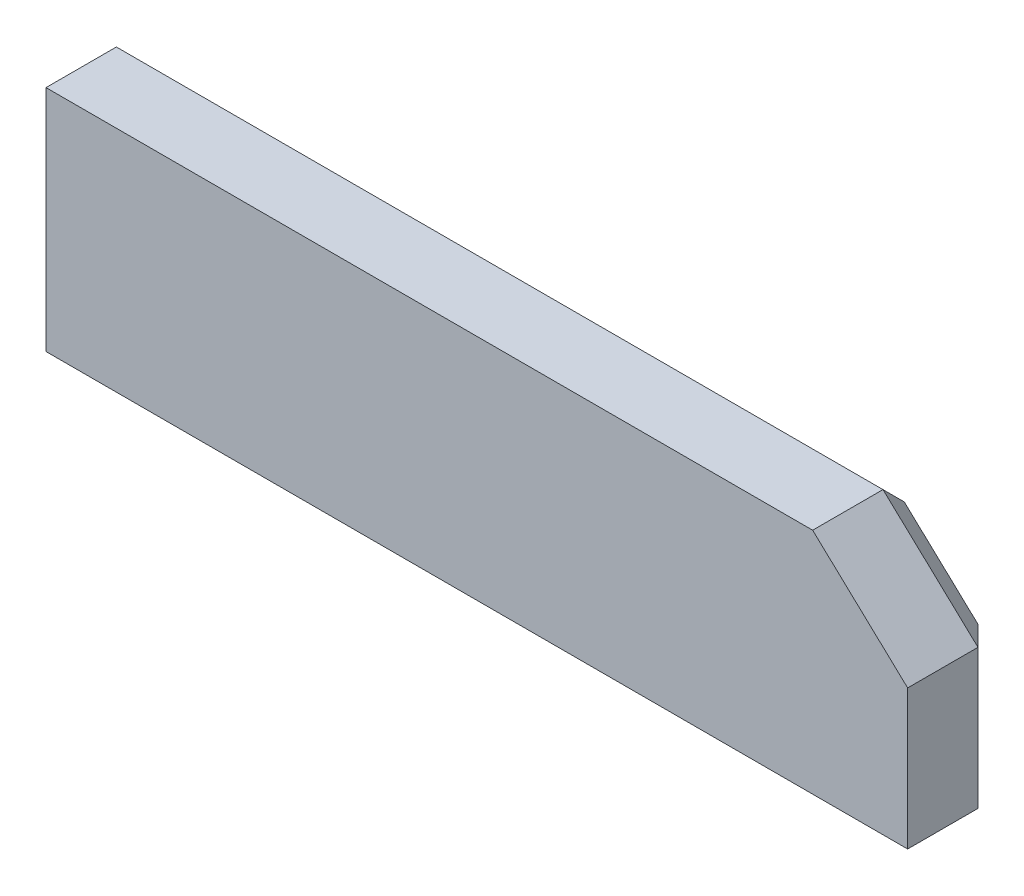
ISO-10303-21;
HEADER;
FILE_DESCRIPTION(('STEP AP214'),'2;1');
FILE_NAME('part.step','',(''),(''),'','','');
FILE_SCHEMA(('AUTOMOTIVE_DESIGN { 1 0 10303 214 1 1 1 1 }'));
ENDSEC;
DATA;
#1=APPLICATION_CONTEXT('core data for automotive mechanical design processes');
#2=APPLICATION_PROTOCOL_DEFINITION('international standard','automotive_design',2000,#1);
#3=PRODUCT_CONTEXT('',#1,'mechanical');
#4=PRODUCT('Part','Part','',(#3));
#5=PRODUCT_RELATED_PRODUCT_CATEGORY('part','',(#4));
#6=PRODUCT_DEFINITION_FORMATION('','',#4);
#7=PRODUCT_DEFINITION_CONTEXT('part definition',#1,'design');
#8=PRODUCT_DEFINITION('design','',#6,#7);
#9=PRODUCT_DEFINITION_SHAPE('','',#8);
#10=(LENGTH_UNIT() NAMED_UNIT(*) SI_UNIT(.MILLI.,.METRE.));
#11=(NAMED_UNIT(*) PLANE_ANGLE_UNIT() SI_UNIT($,.RADIAN.));
#12=(NAMED_UNIT(*) SI_UNIT($,.STERADIAN.) SOLID_ANGLE_UNIT());
#13=UNCERTAINTY_MEASURE_WITH_UNIT(LENGTH_MEASURE(1.E-05),#10,'distance_accuracy_value','');
#14=(GEOMETRIC_REPRESENTATION_CONTEXT(3) GLOBAL_UNCERTAINTY_ASSIGNED_CONTEXT((#13)) GLOBAL_UNIT_ASSIGNED_CONTEXT((#10,
#11,#12)) REPRESENTATION_CONTEXT('',''));
#15=CARTESIAN_POINT('',(0.,0.,0.));
#16=DIRECTION('',(0.,0.,1.));
#17=DIRECTION('',(1.,0.,0.));
#18=AXIS2_PLACEMENT_3D('',#15,#16,#17);
#19=CARTESIAN_POINT('',(0.,7.17888543820057,66.4208203932502));
#20=DIRECTION('',(0.,-0.707106781186551,-0.707106781186544));
#21=DIRECTION('',(1.,0.,0.));
#22=AXIS2_PLACEMENT_3D('',#19,#20,#21);
#23=PLANE('',#22);
#24=DIRECTION('',(0.,0.707106781186545,-0.70710678118655));
#25=VECTOR('',#24,1.);
#26=CARTESIAN_POINT('',(-2.99029162585545,7.17888543820057,66.4208203932502));
#27=LINE('',#26,#25);
#28=CARTESIAN_POINT('',(-2.99029162585545,6.17888543820056,67.4208203932502));
#29=VERTEX_POINT('',#28);
#30=CARTESIAN_POINT('',(-2.99029162585545,7.17888543820057,66.4208203932502));
#31=VERTEX_POINT('',#30);
#32=EDGE_CURVE('E176',#29,#31,#27,.T.);
#33=ORIENTED_EDGE('',*,*,#32,.F.);
#34=DIRECTION('',(1.,0.,0.));
#35=VECTOR('',#34,1.);
#36=CARTESIAN_POINT('',(6.60274775925422,6.17888543820056,67.4208203932502));
#37=LINE('',#36,#35);
#38=CARTESIAN_POINT('',(-17.8972522407458,6.17888543820056,67.4208203932502));
#39=VERTEX_POINT('',#38);
#40=EDGE_CURVE('E46',#39,#29,#37,.T.);
#41=ORIENTED_EDGE('',*,*,#40,.F.);
#42=DIRECTION('',(0.577350269189624,0.577350269189624,-0.57735026918963));
#43=VECTOR('',#42,1.);
#44=CARTESIAN_POINT('',(-11.2648348271639,12.8113028517825,60.7884029796682));
#45=LINE('',#44,#43);
#46=CARTESIAN_POINT('',(-16.8972522407458,7.17888543820056,66.4208203932502));
#47=VERTEX_POINT('',#46);
#48=EDGE_CURVE('E266',#47,#39,#45,.F.);
#49=ORIENTED_EDGE('',*,*,#48,.F.);
#50=DIRECTION('',(-1.,0.,0.));
#51=VECTOR('',#50,1.);
#52=CARTESIAN_POINT('',(-17.8972522407458,7.17888543820056,66.4208203932502));
#53=LINE('',#52,#51);
#54=EDGE_CURVE('E237',#31,#47,#53,.T.);
#55=ORIENTED_EDGE('',*,*,#54,.F.);
#56=EDGE_LOOP('',(#33,#41,#49,#55));
#57=FACE_BOUND('',#56,.T.);
#58=ADVANCED_FACE('F37',(#57),#23,.T.);
#59=CARTESIAN_POINT('',(0.,11.6788854382006,66.4208203932502));
#60=DIRECTION('',(0.,0.707106781186551,-0.707106781186544));
#61=DIRECTION('',(-1.,0.,0.));
#62=AXIS2_PLACEMENT_3D('',#59,#60,#61);
#63=PLANE('',#62);
#64=DIRECTION('',(0.,0.707106781186547,0.707106781186547));
#65=VECTOR('',#64,1.);
#66=CARTESIAN_POINT('',(-2.99029162585545,11.6788854382006,66.4208203932502));
#67=LINE('',#66,#65);
#68=CARTESIAN_POINT('',(-2.99029162585545,11.6788854382006,66.4208203932502));
#69=VERTEX_POINT('',#68);
#70=CARTESIAN_POINT('',(-2.99029162585545,12.6788854382006,67.4208203932502));
#71=VERTEX_POINT('',#70);
#72=EDGE_CURVE('E184',#69,#71,#67,.T.);
#73=ORIENTED_EDGE('',*,*,#72,.F.);
#74=DIRECTION('',(1.,0.,0.));
#75=VECTOR('',#74,1.);
#76=CARTESIAN_POINT('',(3.90106150323635,11.6788854382006,66.4208203932502));
#77=LINE('',#76,#75);
#78=CARTESIAN_POINT('',(-16.8972522407458,11.6788854382006,66.4208203932502));
#79=VERTEX_POINT('',#78);
#80=EDGE_CURVE('E246',#79,#69,#77,.T.);
#81=ORIENTED_EDGE('',*,*,#80,.F.);
#82=DIRECTION('',(-0.577350269189624,0.577350269189624,0.577350269189629));
#83=VECTOR('',#82,1.);
#84=CARTESIAN_POINT('',(-11.2648348271639,6.04646802461866,60.7884029796682));
#85=LINE('',#84,#83);
#86=CARTESIAN_POINT('',(-17.8972522407458,12.6788854382006,67.4208203932502));
#87=VERTEX_POINT('',#86);
#88=EDGE_CURVE('E207',#87,#79,#85,.F.);
#89=ORIENTED_EDGE('',*,*,#88,.F.);
#90=DIRECTION('',(-1.,0.,0.));
#91=VECTOR('',#90,1.);
#92=CARTESIAN_POINT('',(-17.8972522407458,12.6788854382006,67.4208203932502));
#93=LINE('',#92,#91);
#94=EDGE_CURVE('E255',#71,#87,#93,.T.);
#95=ORIENTED_EDGE('',*,*,#94,.F.);
#96=EDGE_LOOP('',(#73,#81,#89,#95));
#97=FACE_BOUND('',#96,.T.);
#98=ADVANCED_FACE('F330',(#97),#63,.T.);
#99=CARTESIAN_POINT('',(0.,0.,66.9208203932502));
#100=DIRECTION('',(0.,0.,-1.));
#101=DIRECTION('',(-1.,0.,0.));
#102=AXIS2_PLACEMENT_3D('',#99,#100,#101);
#103=PLANE('',#102);
#104=DIRECTION('',(1.,0.,0.));
#105=VECTOR('',#104,1.);
#106=CARTESIAN_POINT('',(0.,7.38599221938712,66.9208203932502));
#107=LINE('',#106,#105);
#108=CARTESIAN_POINT('',(-2.99029162585545,7.38599221938712,66.9208203932502));
#109=VERTEX_POINT('',#108);
#110=CARTESIAN_POINT('',(-2.39029162585545,7.38599221938712,66.9208203932502));
#111=VERTEX_POINT('',#110);
#112=EDGE_CURVE('E156',#109,#111,#107,.T.);
#113=ORIENTED_EDGE('',*,*,#112,.F.);
#114=DIRECTION('',(0.,1.,0.));
#115=VECTOR('',#114,1.);
#116=CARTESIAN_POINT('',(-2.99029162585545,11.6788854382006,66.9208203932502));
#117=LINE('',#116,#115);
#118=CARTESIAN_POINT('',(-2.99029162585545,11.471778657014,66.9208203932502));
#119=VERTEX_POINT('',#118);
#120=EDGE_CURVE('E204',#109,#119,#117,.T.);
#121=ORIENTED_EDGE('',*,*,#120,.T.);
#122=DIRECTION('',(1.,0.,0.));
#123=VECTOR('',#122,1.);
#124=CARTESIAN_POINT('',(0.,11.471778657014,66.9208203932502));
#125=LINE('',#124,#123);
#126=CARTESIAN_POINT('',(-2.39029162585545,11.471778657014,66.9208203932502));
#127=VERTEX_POINT('',#126);
#128=EDGE_CURVE('E11',#119,#127,#125,.T.);
#129=ORIENTED_EDGE('',*,*,#128,.T.);
#130=DIRECTION('',(0.,-1.,0.));
#131=VECTOR('',#130,1.);
#132=CARTESIAN_POINT('',(-2.39029162585545,11.6788854382006,66.9208203932502));
#133=LINE('',#132,#131);
#134=EDGE_CURVE('E202',#127,#111,#133,.T.);
#135=ORIENTED_EDGE('',*,*,#134,.T.);
#136=EDGE_LOOP('',(#113,#121,#129,#135));
#137=FACE_BOUND('',#136,.T.);
#138=ADVANCED_FACE('F339',(#137),#103,.T.);
#139=CARTESIAN_POINT('',(0.,0.,66.4208203932502));
#140=DIRECTION('',(0.,0.,-1.));
#141=DIRECTION('',(-1.,0.,0.));
#142=AXIS2_PLACEMENT_3D('',#139,#140,#141);
#143=PLANE('',#142);
#144=CARTESIAN_POINT('',(4.75088968067637,7.99667927246235,66.4208203932502));
#145=DIRECTION('',(0.,0.,-1.));
#146=DIRECTION('',(-1.,0.,0.));
#147=AXIS2_PLACEMENT_3D('',#144,#145,#146);
#148=CIRCLE('',#147,0.333156478538689);
#149=CARTESIAN_POINT('',(4.41773320213768,7.99667927246235,66.4208203932502));
#150=VERTEX_POINT('',#149);
#151=EDGE_CURVE('E359',#150,#150,#148,.T.);
#152=ORIENTED_EDGE('',*,*,#151,.F.);
#153=EDGE_LOOP('',(#152));
#154=FACE_BOUND('',#153,.T.);
#155=CARTESIAN_POINT('',(-1.38982280077938,7.99667927246235,66.4208203932502));
#156=DIRECTION('',(0.,0.,-1.));
#157=DIRECTION('',(-1.,0.,0.));
#158=AXIS2_PLACEMENT_3D('',#155,#156,#157);
#159=CIRCLE('',#158,0.318004989719215);
#160=CARTESIAN_POINT('',(-1.7078277904986,7.99667927246235,66.4208203932502));
#161=VERTEX_POINT('',#160);
#162=EDGE_CURVE('E353',#161,#161,#159,.T.);
#163=ORIENTED_EDGE('',*,*,#162,.F.);
#164=EDGE_LOOP('',(#163));
#165=FACE_BOUND('',#164,.T.);
#166=CARTESIAN_POINT('',(-1.38982280077938,10.8079005875022,66.4208203932502));
#167=DIRECTION('',(0.,0.,-1.));
#168=DIRECTION('',(-1.,0.,0.));
#169=AXIS2_PLACEMENT_3D('',#166,#167,#168);
#170=CIRCLE('',#169,0.344798624935026);
#171=CARTESIAN_POINT('',(-1.73462142571441,10.8079005875022,66.4208203932502));
#172=VERTEX_POINT('',#171);
#173=EDGE_CURVE('E347',#172,#172,#170,.T.);
#174=ORIENTED_EDGE('',*,*,#173,.F.);
#175=EDGE_LOOP('',(#174));
#176=FACE_BOUND('',#175,.T.);
#177=CARTESIAN_POINT('',(3.02332350942283,10.8079005875022,66.4208203932502));
#178=DIRECTION('',(0.,0.,-1.));
#179=DIRECTION('',(-1.,0.,0.));
#180=AXIS2_PLACEMENT_3D('',#177,#178,#179);
#181=CIRCLE('',#180,0.361559636303975);
#182=CARTESIAN_POINT('',(2.66176387311886,10.8079005875022,66.4208203932502));
#183=VERTEX_POINT('',#182);
#184=EDGE_CURVE('E341',#183,#183,#181,.T.);
#185=ORIENTED_EDGE('',*,*,#184,.F.);
#186=EDGE_LOOP('',(#185));
#187=FACE_BOUND('',#186,.T.);
#188=DIRECTION('',(0.,-1.,0.));
#189=VECTOR('',#188,1.);
#190=CARTESIAN_POINT('',(-2.39029162585545,11.6788854382006,66.4208203932502));
#191=LINE('',#190,#189);
#192=CARTESIAN_POINT('',(-2.39029162585545,11.6788854382006,66.4208203932502));
#193=VERTEX_POINT('',#192);
#194=CARTESIAN_POINT('',(-2.39029162585545,7.17888543820057,66.4208203932502));
#195=VERTEX_POINT('',#194);
#196=EDGE_CURVE('E200',#193,#195,#191,.T.);
#197=ORIENTED_EDGE('',*,*,#196,.F.);
#198=CARTESIAN_POINT('',(3.50562763309847,11.6788854382006,66.4208203932502));
#199=VERTEX_POINT('',#198);
#200=EDGE_CURVE('E245',#193,#199,#77,.T.);
#201=ORIENTED_EDGE('',*,*,#200,.T.);
#202=DIRECTION('',(0.729553303098483,-0.683923956253979,0.));
#203=VECTOR('',#202,1.);
#204=CARTESIAN_POINT('',(5.91882380300025,9.41662075551517,66.4208203932502));
#205=LINE('',#204,#203);
#206=CARTESIAN_POINT('',(5.60274775925422,9.7129280676715,66.4208203932502));
#207=VERTEX_POINT('',#206);
#208=EDGE_CURVE('E243',#199,#207,#205,.T.);
#209=ORIENTED_EDGE('',*,*,#208,.T.);
#210=DIRECTION('',(0.,-1.,0.));
#211=VECTOR('',#210,1.);
#212=CARTESIAN_POINT('',(5.60274775925422,6.17888543820056,66.4208203932502));
#213=LINE('',#212,#211);
#214=CARTESIAN_POINT('',(5.60274775925422,7.17888543820057,66.4208203932502));
#215=VERTEX_POINT('',#214);
#216=EDGE_CURVE('E241',#207,#215,#213,.T.);
#217=ORIENTED_EDGE('',*,*,#216,.T.);
#218=EDGE_CURVE('E238',#215,#195,#53,.T.);
#219=ORIENTED_EDGE('',*,*,#218,.T.);
#220=EDGE_LOOP('',(#197,#201,#209,#217,#219));
#221=FACE_BOUND('',#220,.T.);
#222=ADVANCED_FACE('F287',(#154,#165,#176,#187,#221),#143,.T.);
#223=CARTESIAN_POINT('',(6.60274775925423,10.1461740586136,66.4208203932502));
#224=DIRECTION('',(-1.,0.,0.));
#225=DIRECTION('',(0.,-1.,0.));
#226=AXIS2_PLACEMENT_3D('',#223,#224,#225);
#227=PLANE('',#226);
#228=DIRECTION('',(0.,0.,1.));
#229=VECTOR('',#228,1.);
#230=CARTESIAN_POINT('',(6.60274775925422,6.17888543820056,66.4208203932502));
#231=LINE('',#230,#229);
#232=CARTESIAN_POINT('',(6.60274775925422,6.17888543820056,67.4208203932502));
#233=VERTEX_POINT('',#232);
#234=CARTESIAN_POINT('',(6.60274775925422,6.17888543820056,69.4208203932502));
#235=VERTEX_POINT('',#234);
#236=EDGE_CURVE('E235',#233,#235,#231,.T.);
#237=ORIENTED_EDGE('',*,*,#236,.F.);
#238=DIRECTION('',(0.,1.,0.));
#239=VECTOR('',#238,1.);
#240=CARTESIAN_POINT('',(6.60274775925423,10.1461740586136,67.4208203932502));
#241=LINE('',#240,#239);
#242=CARTESIAN_POINT('',(6.60274775925423,10.1461740586136,67.4208203932502));
#243=VERTEX_POINT('',#242);
#244=EDGE_CURVE('E261',#233,#243,#241,.T.);
#245=ORIENTED_EDGE('',*,*,#244,.T.);
#246=DIRECTION('',(0.,0.,1.));
#247=VECTOR('',#246,1.);
#248=CARTESIAN_POINT('',(6.60274775925423,10.1461740586136,66.4208203932502));
#249=LINE('',#248,#247);
#250=CARTESIAN_POINT('',(6.60274775925423,10.1461740586136,69.4208203932502));
#251=VERTEX_POINT('',#250);
#252=EDGE_CURVE('E227',#243,#251,#249,.T.);
#253=ORIENTED_EDGE('',*,*,#252,.T.);
#254=DIRECTION('',(0.,-1.,0.));
#255=VECTOR('',#254,1.);
#256=CARTESIAN_POINT('',(6.60274775925423,10.1461740586136,69.4208203932502));
#257=LINE('',#256,#255);
#258=EDGE_CURVE('E211',#251,#235,#257,.T.);
#259=ORIENTED_EDGE('',*,*,#258,.T.);
#260=EDGE_LOOP('',(#237,#245,#253,#259));
#261=FACE_BOUND('',#260,.T.);
#262=ADVANCED_FACE('F304',(#261),#227,.F.);
#263=CARTESIAN_POINT('',(6.60274775925422,6.17888543820056,66.4208203932502));
#264=DIRECTION('',(0.,1.,0.));
#265=DIRECTION('',(-1.,0.,0.));
#266=AXIS2_PLACEMENT_3D('',#263,#264,#265);
#267=PLANE('',#266);
#268=DIRECTION('',(0.,0.,1.));
#269=VECTOR('',#268,1.);
#270=CARTESIAN_POINT('',(-17.8972522407458,6.17888543820056,66.4208203932502));
#271=LINE('',#270,#269);
#272=CARTESIAN_POINT('',(-17.8972522407458,6.17888543820056,69.4208203932502));
#273=VERTEX_POINT('',#272);
#274=EDGE_CURVE('E233',#39,#273,#271,.T.);
#275=ORIENTED_EDGE('',*,*,#274,.F.);
#276=ORIENTED_EDGE('',*,*,#40,.T.);
#277=DIRECTION('',(-1.,0.,0.));
#278=VECTOR('',#277,1.);
#279=CARTESIAN_POINT('',(-2.99029162585545,6.17888543820056,67.4208203932502));
#280=LINE('',#279,#278);
#281=CARTESIAN_POINT('',(-2.39029162585545,6.17888543820056,67.4208203932502));
#282=VERTEX_POINT('',#281);
#283=EDGE_CURVE('E180',#282,#29,#280,.T.);
#284=ORIENTED_EDGE('',*,*,#283,.F.);
#285=EDGE_CURVE('E60',#282,#233,#37,.T.);
#286=ORIENTED_EDGE('',*,*,#285,.T.);
#287=ORIENTED_EDGE('',*,*,#236,.T.);
#288=DIRECTION('',(-1.,0.,0.));
#289=VECTOR('',#288,1.);
#290=CARTESIAN_POINT('',(6.60274775925422,6.17888543820056,69.4208203932502));
#291=LINE('',#290,#289);
#292=EDGE_CURVE('E214',#235,#273,#291,.T.);
#293=ORIENTED_EDGE('',*,*,#292,.T.);
#294=EDGE_LOOP('',(#275,#276,#284,#286,#287,#293));
#295=FACE_BOUND('',#294,.T.);
#296=ADVANCED_FACE('F307',(#295),#267,.F.);
#297=CARTESIAN_POINT('',(-17.8972522407458,6.17888543820056,66.4208203932502));
#298=DIRECTION('',(1.,0.,0.));
#299=DIRECTION('',(0.,1.,0.));
#300=AXIS2_PLACEMENT_3D('',#297,#298,#299);
#301=PLANE('',#300);
#302=DIRECTION('',(0.,0.,1.));
#303=VECTOR('',#302,1.);
#304=CARTESIAN_POINT('',(-17.8972522407458,12.6788854382006,66.4208203932502));
#305=LINE('',#304,#303);
#306=CARTESIAN_POINT('',(-17.8972522407458,12.6788854382006,69.4208203932502));
#307=VERTEX_POINT('',#306);
#308=EDGE_CURVE('E231',#87,#307,#305,.T.);
#309=ORIENTED_EDGE('',*,*,#308,.F.);
#310=DIRECTION('',(0.,-1.,0.));
#311=VECTOR('',#310,1.);
#312=CARTESIAN_POINT('',(-17.8972522407458,6.17888543820056,67.4208203932502));
#313=LINE('',#312,#311);
#314=EDGE_CURVE('E252',#87,#39,#313,.T.);
#315=ORIENTED_EDGE('',*,*,#314,.T.);
#316=ORIENTED_EDGE('',*,*,#274,.T.);
#317=DIRECTION('',(0.,1.,0.));
#318=VECTOR('',#317,1.);
#319=CARTESIAN_POINT('',(-17.8972522407458,6.17888543820056,69.4208203932502));
#320=LINE('',#319,#318);
#321=EDGE_CURVE('E218',#273,#307,#320,.T.);
#322=ORIENTED_EDGE('',*,*,#321,.T.);
#323=EDGE_LOOP('',(#309,#315,#316,#322));
#324=FACE_BOUND('',#323,.T.);
#325=ADVANCED_FACE('F313',(#324),#301,.F.);
#326=CARTESIAN_POINT('',(-17.8972522407458,12.6788854382006,66.4208203932502));
#327=DIRECTION('',(0.,-1.,0.));
#328=DIRECTION('',(1.,0.,0.));
#329=AXIS2_PLACEMENT_3D('',#326,#327,#328);
#330=PLANE('',#329);
#331=DIRECTION('',(0.,0.,1.));
#332=VECTOR('',#331,1.);
#333=CARTESIAN_POINT('',(3.90106150323635,12.6788854382006,66.4208203932502));
#334=LINE('',#333,#332);
#335=CARTESIAN_POINT('',(3.90106150323635,12.6788854382006,67.4208203932502));
#336=VERTEX_POINT('',#335);
#337=CARTESIAN_POINT('',(3.90106150323635,12.6788854382006,69.4208203932502));
#338=VERTEX_POINT('',#337);
#339=EDGE_CURVE('E229',#336,#338,#334,.T.);
#340=ORIENTED_EDGE('',*,*,#339,.F.);
#341=CARTESIAN_POINT('',(-2.39029162585545,12.6788854382006,67.4208203932502));
#342=VERTEX_POINT('',#341);
#343=EDGE_CURVE('E256',#336,#342,#93,.T.);
#344=ORIENTED_EDGE('',*,*,#343,.T.);
#345=DIRECTION('',(1.,0.,0.));
#346=VECTOR('',#345,1.);
#347=CARTESIAN_POINT('',(-2.99029162585545,12.6788854382006,67.4208203932502));
#348=LINE('',#347,#346);
#349=EDGE_CURVE('E194',#71,#342,#348,.T.);
#350=ORIENTED_EDGE('',*,*,#349,.F.);
#351=ORIENTED_EDGE('',*,*,#94,.T.);
#352=ORIENTED_EDGE('',*,*,#308,.T.);
#353=DIRECTION('',(1.,0.,0.));
#354=VECTOR('',#353,1.);
#355=CARTESIAN_POINT('',(-17.8972522407458,12.6788854382006,69.4208203932502));
#356=LINE('',#355,#354);
#357=EDGE_CURVE('E221',#307,#338,#356,.T.);
#358=ORIENTED_EDGE('',*,*,#357,.T.);
#359=EDGE_LOOP('',(#340,#344,#350,#351,#352,#358));
#360=FACE_BOUND('',#359,.T.);
#361=ADVANCED_FACE('F296',(#360),#330,.F.);
#362=CARTESIAN_POINT('',(3.90106150323635,12.6788854382006,66.4208203932502));
#363=DIRECTION('',(-0.683923956253979,-0.729553303098483,0.));
#364=DIRECTION('',(0.729553303098483,-0.683923956253979,0.));
#365=AXIS2_PLACEMENT_3D('',#362,#363,#364);
#366=PLANE('',#365);
#367=ORIENTED_EDGE('',*,*,#252,.F.);
#368=DIRECTION('',(-0.729553303098483,0.683923956253979,0.));
#369=VECTOR('',#368,1.);
#370=CARTESIAN_POINT('',(3.90106150323635,12.6788854382006,67.4208203932502));
#371=LINE('',#370,#369);
#372=EDGE_CURVE('E259',#243,#336,#371,.T.);
#373=ORIENTED_EDGE('',*,*,#372,.T.);
#374=ORIENTED_EDGE('',*,*,#339,.T.);
#375=DIRECTION('',(0.729553303098482,-0.683923956253978,0.));
#376=VECTOR('',#375,1.);
#377=CARTESIAN_POINT('',(3.90106150323635,12.6788854382006,69.4208203932502));
#378=LINE('',#377,#376);
#379=EDGE_CURVE('E224',#338,#251,#378,.T.);
#380=ORIENTED_EDGE('',*,*,#379,.T.);
#381=EDGE_LOOP('',(#367,#373,#374,#380));
#382=FACE_BOUND('',#381,.T.);
#383=ADVANCED_FACE('F301',(#382),#366,.F.);
#384=DIRECTION('',(0.,1.,0.));
#385=VECTOR('',#384,1.);
#386=CARTESIAN_POINT('',(-2.99029162585545,11.6788854382006,66.4208203932502));
#387=LINE('',#386,#385);
#388=EDGE_CURVE('E205',#31,#69,#387,.T.);
#389=ORIENTED_EDGE('',*,*,#388,.F.);
#390=ORIENTED_EDGE('',*,*,#54,.T.);
#391=DIRECTION('',(0.,1.,0.));
#392=VECTOR('',#391,1.);
#393=CARTESIAN_POINT('',(-16.8972522407458,12.6788854382006,66.4208203932502));
#394=LINE('',#393,#392);
#395=EDGE_CURVE('E249',#47,#79,#394,.T.);
#396=ORIENTED_EDGE('',*,*,#395,.T.);
#397=ORIENTED_EDGE('',*,*,#80,.T.);
#398=EDGE_LOOP('',(#389,#390,#396,#397));
#399=FACE_BOUND('',#398,.T.);
#400=ADVANCED_FACE('F326',(#399),#143,.T.);
#401=CARTESIAN_POINT('',(0.,0.,69.4208203932502));
#402=DIRECTION('',(0.,0.,-1.));
#403=DIRECTION('',(-1.,0.,0.));
#404=AXIS2_PLACEMENT_3D('',#401,#402,#403);
#405=PLANE('',#404);
#406=ORIENTED_EDGE('',*,*,#258,.F.);
#407=ORIENTED_EDGE('',*,*,#379,.F.);
#408=ORIENTED_EDGE('',*,*,#357,.F.);
#409=ORIENTED_EDGE('',*,*,#321,.F.);
#410=ORIENTED_EDGE('',*,*,#292,.F.);
#411=EDGE_LOOP('',(#406,#407,#408,#409,#410));
#412=FACE_BOUND('',#411,.T.);
#413=ADVANCED_FACE('F310',(#412),#405,.F.);
#414=CARTESIAN_POINT('',(5.60274775925421,0.,66.4208203932502));
#415=DIRECTION('',(0.707106781186551,0.,-0.707106781186544));
#416=DIRECTION('',(0.,1.,0.));
#417=AXIS2_PLACEMENT_3D('',#414,#415,#416);
#418=PLANE('',#417);
#419=DIRECTION('',(0.577350269189623,-0.577350269189624,0.57735026918963));
#420=VECTOR('',#419,1.);
#421=CARTESIAN_POINT('',(3.73516517283616,9.04646802461863,64.5532378068321));
#422=LINE('',#421,#420);
#423=EDGE_CURVE('E271',#215,#233,#422,.T.);
#424=ORIENTED_EDGE('',*,*,#423,.F.);
#425=ORIENTED_EDGE('',*,*,#216,.F.);
#426=DIRECTION('',(0.676092174660252,0.292914224178913,0.676092174660258));
#427=VECTOR('',#426,1.);
#428=CARTESIAN_POINT('',(3.67922847962903,8.87957105127395,64.497301113625));
#429=LINE('',#428,#427);
#430=EDGE_CURVE('E215',#243,#207,#429,.F.);
#431=ORIENTED_EDGE('',*,*,#430,.F.);
#432=ORIENTED_EDGE('',*,*,#244,.F.);
#433=EDGE_LOOP('',(#424,#425,#431,#432));
#434=FACE_BOUND('',#433,.T.);
#435=ADVANCED_FACE('F40',(#434),#418,.T.);
#436=CARTESIAN_POINT('',(7.46704904088236,7.96522806718454,66.4208203932502));
#437=DIRECTION('',(0.483607267283123,0.515872087857985,-0.707106781186544));
#438=DIRECTION('',(-0.729553303098483,0.683923956253979,0.));
#439=AXIS2_PLACEMENT_3D('',#436,#437,#438);
#440=PLANE('',#439);
#441=ORIENTED_EDGE('',*,*,#430,.T.);
#442=ORIENTED_EDGE('',*,*,#208,.F.);
#443=DIRECTION('',(0.269285166778209,0.680986600071258,0.680986600071265));
#444=VECTOR('',#443,1.);
#445=CARTESIAN_POINT('',(3.11187916317666,10.6831475926171,65.4250825476667));
#446=LINE('',#445,#444);
#447=EDGE_CURVE('E268',#336,#199,#446,.F.);
#448=ORIENTED_EDGE('',*,*,#447,.F.);
#449=ORIENTED_EDGE('',*,*,#372,.F.);
#450=EDGE_LOOP('',(#441,#442,#448,#449));
#451=FACE_BOUND('',#450,.T.);
#452=ADVANCED_FACE('F278',(#451),#440,.T.);
#453=DIRECTION('',(0.,-0.707106781186545,0.70710678118655));
#454=VECTOR('',#453,1.);
#455=CARTESIAN_POINT('',(-2.39029162585545,7.17888543820057,66.4208203932502));
#456=LINE('',#455,#454);
#457=EDGE_CURVE('E166',#195,#282,#456,.T.);
#458=ORIENTED_EDGE('',*,*,#457,.F.);
#459=ORIENTED_EDGE('',*,*,#218,.F.);
#460=ORIENTED_EDGE('',*,*,#423,.T.);
#461=ORIENTED_EDGE('',*,*,#285,.F.);
#462=EDGE_LOOP('',(#458,#459,#460,#461));
#463=FACE_BOUND('',#462,.T.);
#464=ADVANCED_FACE('F399',(#463),#23,.T.);
#465=DIRECTION('',(0.,-0.707106781186547,-0.707106781186547));
#466=VECTOR('',#465,1.);
#467=CARTESIAN_POINT('',(-2.39029162585545,11.6788854382006,66.4208203932502));
#468=LINE('',#467,#466);
#469=EDGE_CURVE('E188',#342,#193,#468,.T.);
#470=ORIENTED_EDGE('',*,*,#469,.F.);
#471=ORIENTED_EDGE('',*,*,#343,.F.);
#472=ORIENTED_EDGE('',*,*,#447,.T.);
#473=ORIENTED_EDGE('',*,*,#200,.F.);
#474=EDGE_LOOP('',(#470,#471,#472,#473));
#475=FACE_BOUND('',#474,.T.);
#476=ADVANCED_FACE('F291',(#475),#63,.T.);
#477=CARTESIAN_POINT('',(-16.8972522407458,0.,66.4208203932502));
#478=DIRECTION('',(-0.707106781186551,0.,-0.707106781186544));
#479=DIRECTION('',(0.,-1.,0.));
#480=AXIS2_PLACEMENT_3D('',#477,#478,#479);
#481=PLANE('',#480);
#482=ORIENTED_EDGE('',*,*,#48,.T.);
#483=ORIENTED_EDGE('',*,*,#314,.F.);
#484=ORIENTED_EDGE('',*,*,#88,.T.);
#485=ORIENTED_EDGE('',*,*,#395,.F.);
#486=EDGE_LOOP('',(#482,#483,#484,#485));
#487=FACE_BOUND('',#486,.T.);
#488=ADVANCED_FACE('F411',(#487),#481,.T.);
#489=CARTESIAN_POINT('',(-2.39029162585545,11.6788854382006,66.9208203932502));
#490=DIRECTION('',(1.,0.,0.));
#491=DIRECTION('',(0.,0.,-1.));
#492=AXIS2_PLACEMENT_3D('',#489,#490,#491);
#493=PLANE('',#492);
#494=ORIENTED_EDGE('',*,*,#196,.T.);
#495=ORIENTED_EDGE('',*,*,#457,.T.);
#496=DIRECTION('',(0.,-0.707106781186551,-0.707106781186544));
#497=VECTOR('',#496,1.);
#498=CARTESIAN_POINT('',(-2.39029162585545,6.53243882879383,67.7743737838435));
#499=LINE('',#498,#497);
#500=CARTESIAN_POINT('',(-2.39029162585545,6.53243882879383,67.7743737838435));
#501=VERTEX_POINT('',#500);
#502=EDGE_CURVE('E163',#501,#282,#499,.T.);
#503=ORIENTED_EDGE('',*,*,#502,.F.);
#504=DIRECTION('',(0.,-0.707106781186545,0.70710678118655));
#505=VECTOR('',#504,1.);
#506=CARTESIAN_POINT('',(-2.39029162585545,7.53243882879384,66.7743737838435));
#507=LINE('',#506,#505);
#508=EDGE_CURVE('E150',#111,#501,#507,.T.);
#509=ORIENTED_EDGE('',*,*,#508,.F.);
#510=ORIENTED_EDGE('',*,*,#134,.F.);
#511=DIRECTION('',(0.,-0.707106781186547,-0.707106781186547));
#512=VECTOR('',#511,1.);
#513=CARTESIAN_POINT('',(-2.39029162585545,11.3253320476073,66.7743737838435));
#514=LINE('',#513,#512);
#515=CARTESIAN_POINT('',(-2.39029162585545,12.3253320476073,67.7743737838435));
#516=VERTEX_POINT('',#515);
#517=EDGE_CURVE('E53',#516,#127,#514,.T.);
#518=ORIENTED_EDGE('',*,*,#517,.F.);
#519=DIRECTION('',(0.,0.707106781186551,-0.707106781186544));
#520=VECTOR('',#519,1.);
#521=CARTESIAN_POINT('',(-2.39029162585545,12.3253320476073,67.7743737838435));
#522=LINE('',#521,#520);
#523=EDGE_CURVE('E198',#516,#342,#522,.T.);
#524=ORIENTED_EDGE('',*,*,#523,.T.);
#525=ORIENTED_EDGE('',*,*,#469,.T.);
#526=EDGE_LOOP('',(#494,#495,#503,#509,#510,#518,#524,#525));
#527=FACE_BOUND('',#526,.T.);
#528=ADVANCED_FACE('F165',(#527),#493,.F.);
#529=CARTESIAN_POINT('',(-2.99029162585545,11.6788854382006,66.9208203932502));
#530=DIRECTION('',(-1.,0.,0.));
#531=DIRECTION('',(0.,-1.,0.));
#532=AXIS2_PLACEMENT_3D('',#529,#530,#531);
#533=PLANE('',#532);
#534=ORIENTED_EDGE('',*,*,#120,.F.);
#535=DIRECTION('',(0.,0.707106781186545,-0.70710678118655));
#536=VECTOR('',#535,1.);
#537=CARTESIAN_POINT('',(-2.99029162585545,7.53243882879384,66.7743737838435));
#538=LINE('',#537,#536);
#539=CARTESIAN_POINT('',(-2.99029162585545,6.53243882879383,67.7743737838435));
#540=VERTEX_POINT('',#539);
#541=EDGE_CURVE('E160',#540,#109,#538,.T.);
#542=ORIENTED_EDGE('',*,*,#541,.F.);
#543=DIRECTION('',(0.,-0.707106781186551,-0.707106781186544));
#544=VECTOR('',#543,1.);
#545=CARTESIAN_POINT('',(-2.99029162585545,6.53243882879383,67.7743737838435));
#546=LINE('',#545,#544);
#547=EDGE_CURVE('E169',#540,#29,#546,.T.);
#548=ORIENTED_EDGE('',*,*,#547,.T.);
#549=ORIENTED_EDGE('',*,*,#32,.T.);
#550=ORIENTED_EDGE('',*,*,#388,.T.);
#551=ORIENTED_EDGE('',*,*,#72,.T.);
#552=DIRECTION('',(0.,0.707106781186551,-0.707106781186544));
#553=VECTOR('',#552,1.);
#554=CARTESIAN_POINT('',(-2.99029162585545,12.3253320476073,67.7743737838435));
#555=LINE('',#554,#553);
#556=CARTESIAN_POINT('',(-2.99029162585545,12.3253320476073,67.7743737838435));
#557=VERTEX_POINT('',#556);
#558=EDGE_CURVE('E191',#557,#71,#555,.T.);
#559=ORIENTED_EDGE('',*,*,#558,.F.);
#560=DIRECTION('',(0.,0.707106781186547,0.707106781186547));
#561=VECTOR('',#560,1.);
#562=CARTESIAN_POINT('',(-2.99029162585545,11.3253320476073,66.7743737838435));
#563=LINE('',#562,#561);
#564=EDGE_CURVE('E185',#119,#557,#563,.T.);
#565=ORIENTED_EDGE('',*,*,#564,.F.);
#566=EDGE_LOOP('',(#534,#542,#548,#549,#550,#551,#559,#565));
#567=FACE_BOUND('',#566,.T.);
#568=ADVANCED_FACE('F324',(#567),#533,.F.);
#569=CARTESIAN_POINT('',(-2.99029162585545,12.3253320476073,67.7743737838435));
#570=DIRECTION('',(0.,0.707106781186544,0.707106781186551));
#571=DIRECTION('',(0.,-0.707106781186551,0.707106781186544));
#572=AXIS2_PLACEMENT_3D('',#569,#570,#571);
#573=PLANE('',#572);
#574=ORIENTED_EDGE('',*,*,#349,.T.);
#575=ORIENTED_EDGE('',*,*,#523,.F.);
#576=DIRECTION('',(1.,0.,0.));
#577=VECTOR('',#576,1.);
#578=CARTESIAN_POINT('',(-2.99029162585545,12.3253320476073,67.7743737838435));
#579=LINE('',#578,#577);
#580=EDGE_CURVE('E187',#557,#516,#579,.T.);
#581=ORIENTED_EDGE('',*,*,#580,.F.);
#582=ORIENTED_EDGE('',*,*,#558,.T.);
#583=EDGE_LOOP('',(#574,#575,#581,#582));
#584=FACE_BOUND('',#583,.T.);
#585=ADVANCED_FACE('F336',(#584),#573,.F.);
#586=CARTESIAN_POINT('',(0.,-27.7245208681181,27.7245208681181));
#587=DIRECTION('',(0.,0.707106781186548,-0.707106781186548));
#588=DIRECTION('',(0.,0.707106781186548,0.707106781186548));
#589=AXIS2_PLACEMENT_3D('',#586,#587,#588);
#590=PLANE('',#589);
#591=ORIENTED_EDGE('',*,*,#564,.T.);
#592=ORIENTED_EDGE('',*,*,#580,.T.);
#593=ORIENTED_EDGE('',*,*,#517,.T.);
#594=ORIENTED_EDGE('',*,*,#128,.F.);
#595=EDGE_LOOP('',(#591,#592,#593,#594));
#596=FACE_BOUND('',#595,.T.);
#597=ADVANCED_FACE('F337',(#596),#590,.T.);
#598=CARTESIAN_POINT('',(-2.99029162585545,6.53243882879383,67.7743737838435));
#599=DIRECTION('',(0.,-0.707106781186544,0.707106781186551));
#600=DIRECTION('',(0.,-0.707106781186551,-0.707106781186544));
#601=AXIS2_PLACEMENT_3D('',#598,#599,#600);
#602=PLANE('',#601);
#603=ORIENTED_EDGE('',*,*,#283,.T.);
#604=ORIENTED_EDGE('',*,*,#547,.F.);
#605=DIRECTION('',(-1.,0.,0.));
#606=VECTOR('',#605,1.);
#607=CARTESIAN_POINT('',(-2.99029162585545,6.53243882879383,67.7743737838435));
#608=LINE('',#607,#606);
#609=EDGE_CURVE('E154',#501,#540,#608,.T.);
#610=ORIENTED_EDGE('',*,*,#609,.F.);
#611=ORIENTED_EDGE('',*,*,#502,.T.);
#612=EDGE_LOOP('',(#603,#604,#610,#611));
#613=FACE_BOUND('',#612,.T.);
#614=ADVANCED_FACE('F171',(#613),#602,.F.);
#615=CARTESIAN_POINT('',(0.,37.1534063063187,37.1534063063184));
#616=DIRECTION('',(0.,0.70710678118655,0.707106781186545));
#617=DIRECTION('',(0.,-0.707106781186545,0.70710678118655));
#618=AXIS2_PLACEMENT_3D('',#615,#616,#617);
#619=PLANE('',#618);
#620=ORIENTED_EDGE('',*,*,#112,.T.);
#621=ORIENTED_EDGE('',*,*,#508,.T.);
#622=ORIENTED_EDGE('',*,*,#609,.T.);
#623=ORIENTED_EDGE('',*,*,#541,.T.);
#624=EDGE_LOOP('',(#620,#621,#622,#623));
#625=FACE_BOUND('',#624,.T.);
#626=ADVANCED_FACE('F152',(#625),#619,.F.);
#627=CARTESIAN_POINT('',(3.02332350942283,10.8079005875022,66.9208203932502));
#628=DIRECTION('',(0.,0.,-1.));
#629=DIRECTION('',(-1.,0.,0.));
#630=AXIS2_PLACEMENT_3D('',#627,#628,#629);
#631=CYLINDRICAL_SURFACE('',#630,0.361559636303975);
#632=CARTESIAN_POINT('',(3.02332350942283,10.8079005875022,66.9208203932502));
#633=DIRECTION('',(0.,0.,-1.));
#634=DIRECTION('',(-1.,0.,0.));
#635=AXIS2_PLACEMENT_3D('',#632,#633,#634);
#636=CIRCLE('',#635,0.361559636303975);
#637=CARTESIAN_POINT('',(2.66176387311886,10.8079005875022,66.9208203932502));
#638=VERTEX_POINT('',#637);
#639=EDGE_CURVE('E344',#638,#638,#636,.T.);
#640=ORIENTED_EDGE('',*,*,#639,.F.);
#641=EDGE_LOOP('',(#640));
#642=FACE_BOUND('',#641,.T.);
#643=ORIENTED_EDGE('',*,*,#184,.T.);
#644=EDGE_LOOP('',(#643));
#645=FACE_BOUND('',#644,.T.);
#646=ADVANCED_FACE('F383',(#642,#645),#631,.F.);
#647=CARTESIAN_POINT('',(3.02332350942283,10.8079005875022,66.9208203932502));
#648=DIRECTION('',(0.,0.,-1.));
#649=DIRECTION('',(-1.,0.,0.));
#650=AXIS2_PLACEMENT_3D('',#647,#648,#649);
#651=PLANE('',#650);
#652=ORIENTED_EDGE('',*,*,#639,.T.);
#653=EDGE_LOOP('',(#652));
#654=FACE_BOUND('',#653,.T.);
#655=ADVANCED_FACE('F385',(#654),#651,.T.);
#656=CARTESIAN_POINT('',(-1.38982280077938,10.8079005875022,66.9208203932502));
#657=DIRECTION('',(0.,0.,-1.));
#658=DIRECTION('',(-1.,0.,0.));
#659=AXIS2_PLACEMENT_3D('',#656,#657,#658);
#660=CYLINDRICAL_SURFACE('',#659,0.344798624935026);
#661=CARTESIAN_POINT('',(-1.38982280077938,10.8079005875022,66.9208203932502));
#662=DIRECTION('',(0.,0.,-1.));
#663=DIRECTION('',(-1.,0.,0.));
#664=AXIS2_PLACEMENT_3D('',#661,#662,#663);
#665=CIRCLE('',#664,0.344798624935026);
#666=CARTESIAN_POINT('',(-1.73462142571441,10.8079005875022,66.9208203932502));
#667=VERTEX_POINT('',#666);
#668=EDGE_CURVE('E350',#667,#667,#665,.T.);
#669=ORIENTED_EDGE('',*,*,#668,.F.);
#670=EDGE_LOOP('',(#669));
#671=FACE_BOUND('',#670,.T.);
#672=ORIENTED_EDGE('',*,*,#173,.T.);
#673=EDGE_LOOP('',(#672));
#674=FACE_BOUND('',#673,.T.);
#675=ADVANCED_FACE('F392',(#671,#674),#660,.F.);
#676=CARTESIAN_POINT('',(-1.38982280077938,10.8079005875022,66.9208203932502));
#677=DIRECTION('',(0.,0.,-1.));
#678=DIRECTION('',(-1.,0.,0.));
#679=AXIS2_PLACEMENT_3D('',#676,#677,#678);
#680=PLANE('',#679);
#681=ORIENTED_EDGE('',*,*,#668,.T.);
#682=EDGE_LOOP('',(#681));
#683=FACE_BOUND('',#682,.T.);
#684=ADVANCED_FACE('F613',(#683),#680,.T.);
#685=CARTESIAN_POINT('',(-1.38982280077938,7.99667927246235,66.9208203932502));
#686=DIRECTION('',(0.,0.,-1.));
#687=DIRECTION('',(-1.,0.,0.));
#688=AXIS2_PLACEMENT_3D('',#685,#686,#687);
#689=CYLINDRICAL_SURFACE('',#688,0.318004989719215);
#690=CARTESIAN_POINT('',(-1.38982280077938,7.99667927246235,66.9208203932502));
#691=DIRECTION('',(0.,0.,-1.));
#692=DIRECTION('',(-1.,0.,0.));
#693=AXIS2_PLACEMENT_3D('',#690,#691,#692);
#694=CIRCLE('',#693,0.318004989719215);
#695=CARTESIAN_POINT('',(-1.7078277904986,7.99667927246235,66.9208203932502));
#696=VERTEX_POINT('',#695);
#697=EDGE_CURVE('E356',#696,#696,#694,.T.);
#698=ORIENTED_EDGE('',*,*,#697,.F.);
#699=EDGE_LOOP('',(#698));
#700=FACE_BOUND('',#699,.T.);
#701=ORIENTED_EDGE('',*,*,#162,.T.);
#702=EDGE_LOOP('',(#701));
#703=FACE_BOUND('',#702,.T.);
#704=ADVANCED_FACE('F604',(#700,#703),#689,.F.);
#705=CARTESIAN_POINT('',(-1.38982280077938,7.99667927246235,66.9208203932502));
#706=DIRECTION('',(0.,0.,-1.));
#707=DIRECTION('',(-1.,0.,0.));
#708=AXIS2_PLACEMENT_3D('',#705,#706,#707);
#709=PLANE('',#708);
#710=ORIENTED_EDGE('',*,*,#697,.T.);
#711=EDGE_LOOP('',(#710));
#712=FACE_BOUND('',#711,.T.);
#713=ADVANCED_FACE('F370',(#712),#709,.T.);
#714=CARTESIAN_POINT('',(4.75088968067637,7.99667927246235,66.9208203932502));
#715=DIRECTION('',(0.,0.,-1.));
#716=DIRECTION('',(-1.,0.,0.));
#717=AXIS2_PLACEMENT_3D('',#714,#715,#716);
#718=CYLINDRICAL_SURFACE('',#717,0.333156478538689);
#719=CARTESIAN_POINT('',(4.75088968067637,7.99667927246235,66.9208203932502));
#720=DIRECTION('',(0.,0.,-1.));
#721=DIRECTION('',(-1.,0.,0.));
#722=AXIS2_PLACEMENT_3D('',#719,#720,#721);
#723=CIRCLE('',#722,0.333156478538689);
#724=CARTESIAN_POINT('',(4.41773320213768,7.99667927246235,66.9208203932502));
#725=VERTEX_POINT('',#724);
#726=EDGE_CURVE('E178',#725,#725,#723,.T.);
#727=ORIENTED_EDGE('',*,*,#726,.F.);
#728=EDGE_LOOP('',(#727));
#729=FACE_BOUND('',#728,.T.);
#730=ORIENTED_EDGE('',*,*,#151,.T.);
#731=EDGE_LOOP('',(#730));
#732=FACE_BOUND('',#731,.T.);
#733=ADVANCED_FACE('F367',(#729,#732),#718,.F.);
#734=CARTESIAN_POINT('',(4.75088968067637,7.99667927246235,66.9208203932502));
#735=DIRECTION('',(0.,0.,-1.));
#736=DIRECTION('',(-1.,0.,0.));
#737=AXIS2_PLACEMENT_3D('',#734,#735,#736);
#738=PLANE('',#737);
#739=ORIENTED_EDGE('',*,*,#726,.T.);
#740=EDGE_LOOP('',(#739));
#741=FACE_BOUND('',#740,.T.);
#742=ADVANCED_FACE('F365',(#741),#738,.T.);
#743=CLOSED_SHELL('',(#58,#98,#138,#222,#262,#296,#325,#361,#383,#400,#413,#435,#452,#464,#476,
#488,#528,#568,#585,#597,#614,#626,#646,#655,#675,#684,#704,#713,#733,#742));
#744=MANIFOLD_SOLID_BREP('B2',#743);
#745=ADVANCED_BREP_SHAPE_REPRESENTATION('',(#18,#744),#14);
#746=SHAPE_DEFINITION_REPRESENTATION(#9,#745);
ENDSEC;
END-ISO-10303-21;
